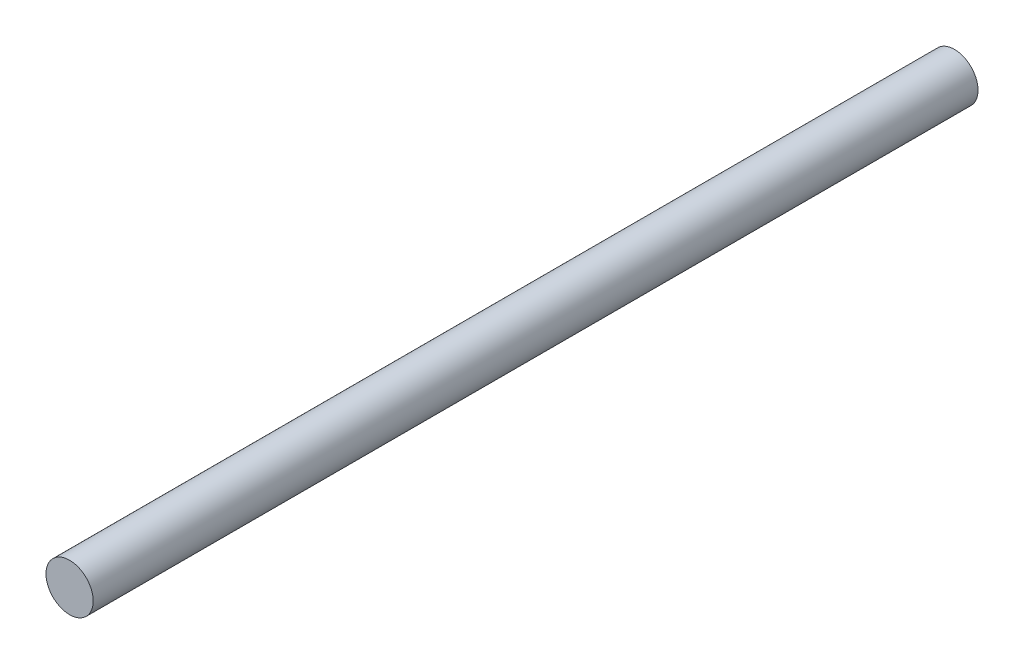
ISO-10303-21;
HEADER;
FILE_DESCRIPTION(('STEP AP214'),'2;1');
FILE_NAME('part.step','',(''),(''),'','','');
FILE_SCHEMA(('AUTOMOTIVE_DESIGN { 1 0 10303 214 1 1 1 1 }'));
ENDSEC;
DATA;
#1=APPLICATION_CONTEXT('core data for automotive mechanical design processes');
#2=APPLICATION_PROTOCOL_DEFINITION('international standard','automotive_design',2000,#1);
#3=PRODUCT_CONTEXT('',#1,'mechanical');
#4=PRODUCT('Part','Part','',(#3));
#5=PRODUCT_RELATED_PRODUCT_CATEGORY('part','',(#4));
#6=PRODUCT_DEFINITION_FORMATION('','',#4);
#7=PRODUCT_DEFINITION_CONTEXT('part definition',#1,'design');
#8=PRODUCT_DEFINITION('design','',#6,#7);
#9=PRODUCT_DEFINITION_SHAPE('','',#8);
#10=(LENGTH_UNIT() NAMED_UNIT(*) SI_UNIT(.MILLI.,.METRE.));
#11=(NAMED_UNIT(*) PLANE_ANGLE_UNIT() SI_UNIT($,.RADIAN.));
#12=(NAMED_UNIT(*) SI_UNIT($,.STERADIAN.) SOLID_ANGLE_UNIT());
#13=UNCERTAINTY_MEASURE_WITH_UNIT(LENGTH_MEASURE(1.E-05),#10,'distance_accuracy_value','');
#14=(GEOMETRIC_REPRESENTATION_CONTEXT(3) GLOBAL_UNCERTAINTY_ASSIGNED_CONTEXT((#13)) GLOBAL_UNIT_ASSIGNED_CONTEXT((#10,
#11,#12)) REPRESENTATION_CONTEXT('',''));
#15=CARTESIAN_POINT('',(0.,0.,0.));
#16=DIRECTION('',(0.,0.,1.));
#17=DIRECTION('',(1.,0.,0.));
#18=AXIS2_PLACEMENT_3D('',#15,#16,#17);
#19=CARTESIAN_POINT('',(0.3999992,0.,0.));
#20=DIRECTION('',(0.,0.,-1.));
#21=DIRECTION('',(-1.,0.,0.));
#22=AXIS2_PLACEMENT_3D('',#19,#20,#21);
#23=PLANE('',#22);
#24=CARTESIAN_POINT('',(0.,0.,0.));
#25=DIRECTION('',(0.,0.,-1.));
#26=DIRECTION('',(-1.,0.,0.));
#27=AXIS2_PLACEMENT_3D('',#24,#25,#26);
#28=CIRCLE('',#27,0.3999992);
#29=CARTESIAN_POINT('',(-0.3999992,0.,0.));
#30=VERTEX_POINT('',#29);
#31=EDGE_CURVE('E18',#30,#30,#28,.F.);
#32=ORIENTED_EDGE('',*,*,#31,.F.);
#33=EDGE_LOOP('',(#32));
#34=FACE_BOUND('',#33,.T.);
#35=ADVANCED_FACE('F15',(#34),#23,.T.);
#36=CARTESIAN_POINT('',(0.3999992,0.,15.00000048));
#37=DIRECTION('',(0.,0.,-1.));
#38=DIRECTION('',(-1.,0.,0.));
#39=AXIS2_PLACEMENT_3D('',#36,#37,#38);
#40=PLANE('',#39);
#41=CARTESIAN_POINT('',(0.,0.,15.00000048));
#42=DIRECTION('',(0.,0.,-1.));
#43=DIRECTION('',(-1.,0.,0.));
#44=AXIS2_PLACEMENT_3D('',#41,#42,#43);
#45=CIRCLE('',#44,0.3999992);
#46=CARTESIAN_POINT('',(-0.3999992,0.,15.00000048));
#47=VERTEX_POINT('',#46);
#48=EDGE_CURVE('E10',#47,#47,#45,.T.);
#49=ORIENTED_EDGE('',*,*,#48,.F.);
#50=EDGE_LOOP('',(#49));
#51=FACE_BOUND('',#50,.T.);
#52=ADVANCED_FACE('F30',(#51),#40,.F.);
#53=CARTESIAN_POINT('',(0.,0.,0.));
#54=DIRECTION('',(0.,0.,-1.));
#55=DIRECTION('',(-1.,0.,0.));
#56=AXIS2_PLACEMENT_3D('',#53,#54,#55);
#57=CYLINDRICAL_SURFACE('',#56,0.3999992);
#58=ORIENTED_EDGE('',*,*,#48,.T.);
#59=EDGE_LOOP('',(#58));
#60=FACE_BOUND('',#59,.T.);
#61=ORIENTED_EDGE('',*,*,#31,.T.);
#62=EDGE_LOOP('',(#61));
#63=FACE_BOUND('',#62,.T.);
#64=ADVANCED_FACE('F27',(#60,#63),#57,.T.);
#65=CLOSED_SHELL('',(#35,#52,#64));
#66=MANIFOLD_SOLID_BREP('B1',#65);
#67=ADVANCED_BREP_SHAPE_REPRESENTATION('',(#18,#66),#14);
#68=SHAPE_DEFINITION_REPRESENTATION(#9,#67);
ENDSEC;
END-ISO-10303-21;
